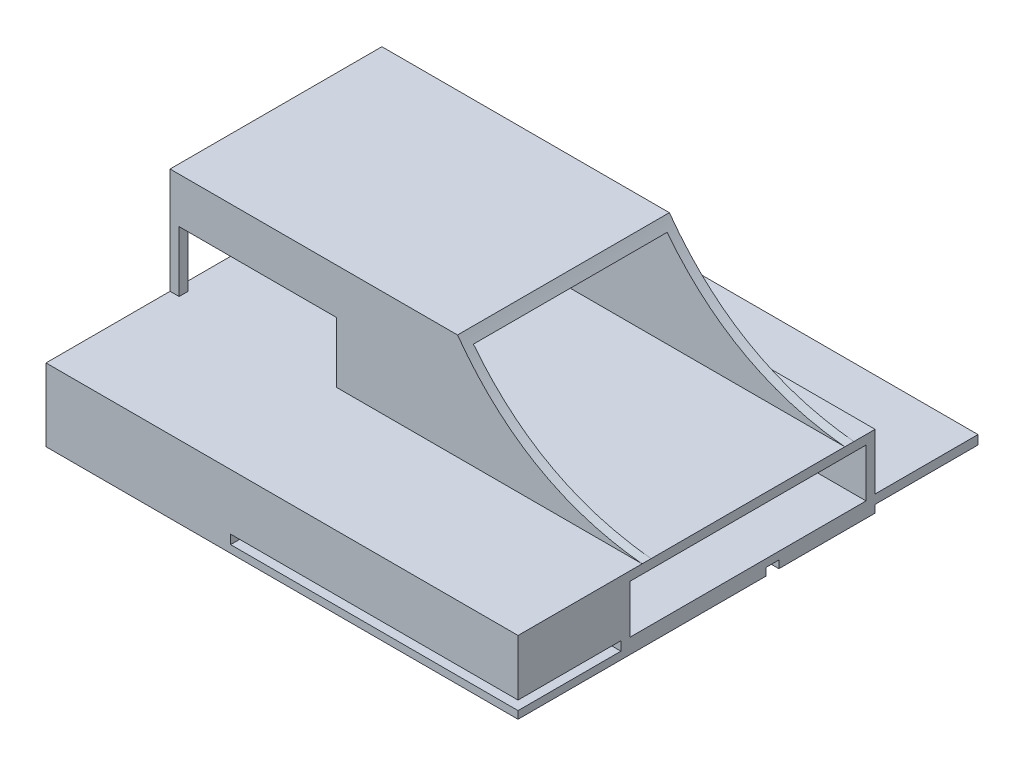
ISO-10303-21;
HEADER;
FILE_DESCRIPTION(('STEP AP214'),'2;1');
FILE_NAME('part.step','',(''),(''),'','','');
FILE_SCHEMA(('AUTOMOTIVE_DESIGN { 1 0 10303 214 1 1 1 1 }'));
ENDSEC;
DATA;
#1=APPLICATION_CONTEXT('core data for automotive mechanical design processes');
#2=APPLICATION_PROTOCOL_DEFINITION('international standard','automotive_design',2000,#1);
#3=PRODUCT_CONTEXT('',#1,'mechanical');
#4=PRODUCT('Part','Part','',(#3));
#5=PRODUCT_RELATED_PRODUCT_CATEGORY('part','',(#4));
#6=PRODUCT_DEFINITION_FORMATION('','',#4);
#7=PRODUCT_DEFINITION_CONTEXT('part definition',#1,'design');
#8=PRODUCT_DEFINITION('design','',#6,#7);
#9=PRODUCT_DEFINITION_SHAPE('','',#8);
#10=(LENGTH_UNIT() NAMED_UNIT(*) SI_UNIT(.MILLI.,.METRE.));
#11=(NAMED_UNIT(*) PLANE_ANGLE_UNIT() SI_UNIT($,.RADIAN.));
#12=(NAMED_UNIT(*) SI_UNIT($,.STERADIAN.) SOLID_ANGLE_UNIT());
#13=UNCERTAINTY_MEASURE_WITH_UNIT(LENGTH_MEASURE(1.E-05),#10,'distance_accuracy_value','');
#14=(GEOMETRIC_REPRESENTATION_CONTEXT(3) GLOBAL_UNCERTAINTY_ASSIGNED_CONTEXT((#13)) GLOBAL_UNIT_ASSIGNED_CONTEXT((#10,
#11,#12)) REPRESENTATION_CONTEXT('',''));
#15=CARTESIAN_POINT('',(0.,0.,0.));
#16=DIRECTION('',(0.,0.,1.));
#17=DIRECTION('',(1.,0.,0.));
#18=AXIS2_PLACEMENT_3D('',#15,#16,#17);
#19=CARTESIAN_POINT('',(-54.2981884270388,0.,19.0270270270271));
#20=DIRECTION('',(0.,0.,-1.));
#21=DIRECTION('',(0.,1.,0.));
#22=AXIS2_PLACEMENT_3D('',#19,#20,#21);
#23=PLANE('',#22);
#24=DIRECTION('',(0.,-1.,0.));
#25=VECTOR('',#24,1.);
#26=CARTESIAN_POINT('',(0.701811572961224,0.,19.0270270270271));
#27=LINE('',#26,#25);
#28=CARTESIAN_POINT('',(0.701811572961224,44.,19.0270270270271));
#29=VERTEX_POINT('',#28);
#30=CARTESIAN_POINT('',(0.701811572961224,24.,19.0270270270271));
#31=VERTEX_POINT('',#30);
#32=EDGE_CURVE('E330',#29,#31,#27,.T.);
#33=ORIENTED_EDGE('',*,*,#32,.T.);
#34=DIRECTION('',(1.,0.,0.));
#35=VECTOR('',#34,1.);
#36=CARTESIAN_POINT('',(-54.2981884270388,24.,19.0270270270271));
#37=LINE('',#36,#35);
#38=CARTESIAN_POINT('',(101.701811572961,24.,19.0270270270271));
#39=VERTEX_POINT('',#38);
#40=EDGE_CURVE('E464',#31,#39,#37,.T.);
#41=ORIENTED_EDGE('',*,*,#40,.T.);
#42=CARTESIAN_POINT('',(40.7018115729612,59.,19.0270270270271));
#43=CARTESIAN_POINT('',(63.2326989801919,27.7966980544731,19.0270270270271));
#44=CARTESIAN_POINT('',(101.701811572961,24.,19.0270270270271));
#45=B_SPLINE_CURVE_WITH_KNOTS('',2,(#42,#43,#44),.UNSPECIFIED.,.F.,.F.,(3,3),(0.,1.),.UNSPECIFIED.);
#46=CARTESIAN_POINT('',(40.7018115729612,59.,19.0270270270271));
#47=VERTEX_POINT('',#46);
#48=EDGE_CURVE('E342',#47,#39,#45,.T.);
#49=ORIENTED_EDGE('',*,*,#48,.F.);
#50=DIRECTION('',(1.,0.,0.));
#51=VECTOR('',#50,1.);
#52=CARTESIAN_POINT('',(-54.2981884270388,59.,19.0270270270271));
#53=LINE('',#52,#51);
#54=CARTESIAN_POINT('',(-54.2981884270388,59.,19.0270270270271));
#55=VERTEX_POINT('',#54);
#56=EDGE_CURVE('E472',#55,#47,#53,.T.);
#57=ORIENTED_EDGE('',*,*,#56,.F.);
#58=DIRECTION('',(0.,1.,0.));
#59=VECTOR('',#58,1.);
#60=CARTESIAN_POINT('',(-54.2981884270388,0.,19.0270270270271));
#61=LINE('',#60,#59);
#62=CARTESIAN_POINT('',(-54.2981884270388,24.,19.0270270270271));
#63=VERTEX_POINT('',#62);
#64=EDGE_CURVE('E462',#63,#55,#61,.T.);
#65=ORIENTED_EDGE('',*,*,#64,.F.);
#66=CARTESIAN_POINT('',(-51.2981884270388,24.,19.0270270270271));
#67=VERTEX_POINT('',#66);
#68=EDGE_CURVE('E459',#63,#67,#37,.T.);
#69=ORIENTED_EDGE('',*,*,#68,.T.);
#70=DIRECTION('',(0.,1.,0.));
#71=VECTOR('',#70,1.);
#72=CARTESIAN_POINT('',(-51.2981884270388,0.,19.0270270270271));
#73=LINE('',#72,#71);
#74=CARTESIAN_POINT('',(-51.2981884270388,44.,19.0270270270271));
#75=VERTEX_POINT('',#74);
#76=EDGE_CURVE('E336',#67,#75,#73,.T.);
#77=ORIENTED_EDGE('',*,*,#76,.T.);
#78=DIRECTION('',(1.,0.,0.));
#79=VECTOR('',#78,1.);
#80=CARTESIAN_POINT('',(0.,44.,19.0270270270271));
#81=LINE('',#80,#79);
#82=EDGE_CURVE('E333',#75,#29,#81,.T.);
#83=ORIENTED_EDGE('',*,*,#82,.T.);
#84=EDGE_LOOP('',(#33,#41,#49,#57,#65,#69,#77,#83));
#85=FACE_BOUND('',#84,.T.);
#86=ADVANCED_FACE('F35',(#85),#23,.F.);
#87=CARTESIAN_POINT('',(-54.2981884270388,0.,16.0270270270271));
#88=DIRECTION('',(0.,0.,1.));
#89=DIRECTION('',(1.,0.,0.));
#90=AXIS2_PLACEMENT_3D('',#87,#88,#89);
#91=PLANE('',#90);
#92=DIRECTION('',(0.,-1.,0.));
#93=VECTOR('',#92,1.);
#94=CARTESIAN_POINT('',(0.701811572961224,0.,16.0270270270271));
#95=LINE('',#94,#93);
#96=CARTESIAN_POINT('',(0.701811572961224,44.,16.0270270270271));
#97=VERTEX_POINT('',#96);
#98=CARTESIAN_POINT('',(0.701811572961224,24.,16.0270270270271));
#99=VERTEX_POINT('',#98);
#100=EDGE_CURVE('E11',#97,#99,#95,.T.);
#101=ORIENTED_EDGE('',*,*,#100,.F.);
#102=DIRECTION('',(1.,0.,0.));
#103=VECTOR('',#102,1.);
#104=CARTESIAN_POINT('',(-54.2981884270388,44.,16.0270270270271));
#105=LINE('',#104,#103);
#106=CARTESIAN_POINT('',(-51.2981884270388,44.,16.0270270270271));
#107=VERTEX_POINT('',#106);
#108=EDGE_CURVE('E531',#107,#97,#105,.T.);
#109=ORIENTED_EDGE('',*,*,#108,.F.);
#110=DIRECTION('',(0.,1.,0.));
#111=VECTOR('',#110,1.);
#112=CARTESIAN_POINT('',(-51.2981884270388,0.,16.0270270270271));
#113=LINE('',#112,#111);
#114=CARTESIAN_POINT('',(-51.2981884270388,24.,16.0270270270271));
#115=VERTEX_POINT('',#114);
#116=EDGE_CURVE('E43',#115,#107,#113,.T.);
#117=ORIENTED_EDGE('',*,*,#116,.F.);
#118=DIRECTION('',(1.,0.,0.));
#119=VECTOR('',#118,1.);
#120=CARTESIAN_POINT('',(-54.2981884270388,24.,16.0270270270271));
#121=LINE('',#120,#119);
#122=CARTESIAN_POINT('',(-54.2981884270388,24.,16.0270270270271));
#123=VERTEX_POINT('',#122);
#124=EDGE_CURVE('E501',#123,#115,#121,.T.);
#125=ORIENTED_EDGE('',*,*,#124,.F.);
#126=DIRECTION('',(0.,-1.,0.));
#127=VECTOR('',#126,1.);
#128=CARTESIAN_POINT('',(-54.2981884270388,0.,16.0270270270271));
#129=LINE('',#128,#127);
#130=CARTESIAN_POINT('',(-54.2981884270388,56.,16.0270270270271));
#131=VERTEX_POINT('',#130);
#132=EDGE_CURVE('E480',#131,#123,#129,.T.);
#133=ORIENTED_EDGE('',*,*,#132,.F.);
#134=DIRECTION('',(1.,0.,0.));
#135=VECTOR('',#134,1.);
#136=CARTESIAN_POINT('',(-54.2981884270388,56.,16.0270270270271));
#137=LINE('',#136,#135);
#138=CARTESIAN_POINT('',(42.954258478646,56.0000000095578,16.0270270270271));
#139=VERTEX_POINT('',#138);
#140=EDGE_CURVE('E490',#131,#139,#137,.T.);
#141=ORIENTED_EDGE('',*,*,#140,.T.);
#142=CARTESIAN_POINT('',(40.7018115729612,59.,16.0270270270271));
#143=CARTESIAN_POINT('',(63.2326989801919,27.7966980544731,16.0270270270271));
#144=CARTESIAN_POINT('',(101.701811572961,24.,16.0270270270271));
#145=B_SPLINE_CURVE_WITH_KNOTS('',2,(#142,#143,#144),.UNSPECIFIED.,.F.,.F.,(3,3),(0.,1.),.UNSPECIFIED.);
#146=CARTESIAN_POINT('',(101.701811572961,24.,16.0270270270271));
#147=VERTEX_POINT('',#146);
#148=EDGE_CURVE('E526',#139,#147,#145,.T.);
#149=ORIENTED_EDGE('',*,*,#148,.T.);
#150=EDGE_CURVE('E504',#99,#147,#121,.T.);
#151=ORIENTED_EDGE('',*,*,#150,.F.);
#152=EDGE_LOOP('',(#101,#109,#117,#125,#133,#141,#149,#151));
#153=FACE_BOUND('',#152,.T.);
#154=ADVANCED_FACE('F408',(#153),#91,.F.);
#155=CARTESIAN_POINT('',(-54.2981884270388,59.,-57.9729729729729));
#156=DIRECTION('',(1.,0.,0.));
#157=DIRECTION('',(0.,0.,-1.));
#158=AXIS2_PLACEMENT_3D('',#155,#156,#157);
#159=PLANE('',#158);
#160=DIRECTION('',(0.,0.,1.));
#161=VECTOR('',#160,1.);
#162=CARTESIAN_POINT('',(-54.2981884270388,24.,0.));
#163=LINE('',#162,#161);
#164=CARTESIAN_POINT('',(-54.2981884270388,24.,60.0270270270271));
#165=VERTEX_POINT('',#164);
#166=EDGE_CURVE('E457',#63,#165,#163,.T.);
#167=ORIENTED_EDGE('',*,*,#166,.F.);
#168=ORIENTED_EDGE('',*,*,#64,.T.);
#169=DIRECTION('',(0.,0.,1.));
#170=VECTOR('',#169,1.);
#171=CARTESIAN_POINT('',(-54.2981884270388,59.,-57.9729729729729));
#172=LINE('',#171,#170);
#173=CARTESIAN_POINT('',(-54.2981884270388,59.,-50.9729729729729));
#174=VERTEX_POINT('',#173);
#175=EDGE_CURVE('E507',#174,#55,#172,.T.);
#176=ORIENTED_EDGE('',*,*,#175,.F.);
#177=DIRECTION('',(0.,1.,0.));
#178=VECTOR('',#177,1.);
#179=CARTESIAN_POINT('',(-54.2981884270388,0.,-50.9729729729729));
#180=LINE('',#179,#178);
#181=CARTESIAN_POINT('',(-54.2981884270388,24.,-50.9729729729729));
#182=VERTEX_POINT('',#181);
#183=EDGE_CURVE('E545',#182,#174,#180,.T.);
#184=ORIENTED_EDGE('',*,*,#183,.F.);
#185=DIRECTION('',(0.,0.,1.));
#186=VECTOR('',#185,1.);
#187=CARTESIAN_POINT('',(-54.2981884270388,24.,0.));
#188=LINE('',#187,#186);
#189=CARTESIAN_POINT('',(-54.2981884270388,24.,-57.9729729729729));
#190=VERTEX_POINT('',#189);
#191=EDGE_CURVE('E539',#190,#182,#188,.T.);
#192=ORIENTED_EDGE('',*,*,#191,.F.);
#193=DIRECTION('',(0.,-1.,0.));
#194=VECTOR('',#193,1.);
#195=CARTESIAN_POINT('',(-54.2981884270388,59.,-57.9729729729729));
#196=LINE('',#195,#194);
#197=CARTESIAN_POINT('',(-54.2981884270388,0.,-57.9729729729729));
#198=VERTEX_POINT('',#197);
#199=EDGE_CURVE('E510',#190,#198,#196,.T.);
#200=ORIENTED_EDGE('',*,*,#199,.T.);
#201=DIRECTION('',(0.,0.,1.));
#202=VECTOR('',#201,1.);
#203=CARTESIAN_POINT('',(-54.2981884270388,0.,-57.9729729729729));
#204=LINE('',#203,#202);
#205=CARTESIAN_POINT('',(-54.2981884270388,0.,-26.1729729729729));
#206=VERTEX_POINT('',#205);
#207=EDGE_CURVE('E512',#198,#206,#204,.T.);
#208=ORIENTED_EDGE('',*,*,#207,.T.);
#209=DIRECTION('',(0.,-1.,0.));
#210=VECTOR('',#209,1.);
#211=CARTESIAN_POINT('',(-54.2981884270388,0.,-26.1729729729729));
#212=LINE('',#211,#210);
#213=CARTESIAN_POINT('',(-54.2981884270388,2.5,-26.1729729729729));
#214=VERTEX_POINT('',#213);
#215=EDGE_CURVE('E593',#214,#206,#212,.T.);
#216=ORIENTED_EDGE('',*,*,#215,.F.);
#217=DIRECTION('',(0.,0.,-1.));
#218=VECTOR('',#217,1.);
#219=CARTESIAN_POINT('',(-54.2981884270388,2.5,0.));
#220=LINE('',#219,#218);
#221=CARTESIAN_POINT('',(-54.2981884270388,2.5,-21.9729729729729));
#222=VERTEX_POINT('',#221);
#223=EDGE_CURVE('E595',#222,#214,#220,.T.);
#224=ORIENTED_EDGE('',*,*,#223,.F.);
#225=DIRECTION('',(0.,1.,0.));
#226=VECTOR('',#225,1.);
#227=CARTESIAN_POINT('',(-54.2981884270388,0.,-21.9729729729729));
#228=LINE('',#227,#226);
#229=CARTESIAN_POINT('',(-54.2981884270388,0.,-21.9729729729729));
#230=VERTEX_POINT('',#229);
#231=EDGE_CURVE('E598',#230,#222,#228,.T.);
#232=ORIENTED_EDGE('',*,*,#231,.F.);
#233=CARTESIAN_POINT('',(-54.2981884270388,0.,60.0270270270271));
#234=VERTEX_POINT('',#233);
#235=EDGE_CURVE('E497',#230,#234,#204,.T.);
#236=ORIENTED_EDGE('',*,*,#235,.T.);
#237=DIRECTION('',(0.,-1.,0.));
#238=VECTOR('',#237,1.);
#239=CARTESIAN_POINT('',(-54.2981884270388,0.,60.0270270270271));
#240=LINE('',#239,#238);
#241=EDGE_CURVE('E280',#165,#234,#240,.T.);
#242=ORIENTED_EDGE('',*,*,#241,.F.);
#243=EDGE_LOOP('',(#167,#168,#176,#184,#192,#200,#208,#216,#224,#232,#236,#242));
#244=FACE_BOUND('',#243,.T.);
#245=DIRECTION('',(0.,1.,0.));
#246=VECTOR('',#245,1.);
#247=CARTESIAN_POINT('',(-54.2981884270388,0.,-47.9729729729729));
#248=LINE('',#247,#246);
#249=CARTESIAN_POINT('',(-54.2981884270388,24.,-47.9729729729729));
#250=VERTEX_POINT('',#249);
#251=CARTESIAN_POINT('',(-54.2981884270388,56.,-47.9729729729729));
#252=VERTEX_POINT('',#251);
#253=EDGE_CURVE('E487',#250,#252,#248,.T.);
#254=ORIENTED_EDGE('',*,*,#253,.T.);
#255=DIRECTION('',(0.,0.,1.));
#256=VECTOR('',#255,1.);
#257=CARTESIAN_POINT('',(-54.2981884270388,56.,0.));
#258=LINE('',#257,#256);
#259=EDGE_CURVE('E477',#252,#131,#258,.T.);
#260=ORIENTED_EDGE('',*,*,#259,.T.);
#261=ORIENTED_EDGE('',*,*,#132,.T.);
#262=DIRECTION('',(0.,0.,1.));
#263=VECTOR('',#262,1.);
#264=CARTESIAN_POINT('',(-54.2981884270388,24.,0.));
#265=LINE('',#264,#263);
#266=EDGE_CURVE('E484',#250,#123,#265,.T.);
#267=ORIENTED_EDGE('',*,*,#266,.F.);
#268=EDGE_LOOP('',(#254,#260,#261,#267));
#269=FACE_BOUND('',#268,.T.);
#270=DIRECTION('',(0.,-1.,0.));
#271=VECTOR('',#270,1.);
#272=CARTESIAN_POINT('',(-54.2981884270388,0.,-54.9729729729729));
#273=LINE('',#272,#271);
#274=CARTESIAN_POINT('',(-54.2981884270388,21.,-54.9729729729729));
#275=VERTEX_POINT('',#274);
#276=CARTESIAN_POINT('',(-54.2981884270388,5.,-54.9729729729729));
#277=VERTEX_POINT('',#276);
#278=EDGE_CURVE('E617',#275,#277,#273,.T.);
#279=ORIENTED_EDGE('',*,*,#278,.F.);
#280=DIRECTION('',(0.,0.,-1.));
#281=VECTOR('',#280,1.);
#282=CARTESIAN_POINT('',(-54.2981884270388,21.,0.));
#283=LINE('',#282,#281);
#284=CARTESIAN_POINT('',(-54.2981884270388,21.,23.0270270270271));
#285=VERTEX_POINT('',#284);
#286=EDGE_CURVE('E619',#285,#275,#283,.T.);
#287=ORIENTED_EDGE('',*,*,#286,.F.);
#288=DIRECTION('',(0.,1.,0.));
#289=VECTOR('',#288,1.);
#290=CARTESIAN_POINT('',(-54.2981884270388,0.,23.0270270270271));
#291=LINE('',#290,#289);
#292=CARTESIAN_POINT('',(-54.2981884270388,5.,23.0270270270271));
#293=VERTEX_POINT('',#292);
#294=EDGE_CURVE('E622',#293,#285,#291,.T.);
#295=ORIENTED_EDGE('',*,*,#294,.F.);
#296=DIRECTION('',(0.,0.,1.));
#297=VECTOR('',#296,1.);
#298=CARTESIAN_POINT('',(-54.2981884270388,5.,0.));
#299=LINE('',#298,#297);
#300=EDGE_CURVE('E625',#277,#293,#299,.T.);
#301=ORIENTED_EDGE('',*,*,#300,.F.);
#302=EDGE_LOOP('',(#279,#287,#295,#301));
#303=FACE_BOUND('',#302,.T.);
#304=ADVANCED_FACE('F37',(#244,#269,#303),#159,.F.);
#305=CARTESIAN_POINT('',(-54.2981884270388,59.,26.0270270270271));
#306=DIRECTION('',(0.,0.,-1.));
#307=DIRECTION('',(-1.,0.,0.));
#308=AXIS2_PLACEMENT_3D('',#305,#306,#307);
#309=PLANE('',#308);
#310=DIRECTION('',(0.,-1.,0.));
#311=VECTOR('',#310,1.);
#312=CARTESIAN_POINT('',(6.70181157296122,0.,26.0270270270271));
#313=LINE('',#312,#311);
#314=CARTESIAN_POINT('',(6.70181157296122,5.49999999999999,26.0270270270271));
#315=VERTEX_POINT('',#314);
#316=CARTESIAN_POINT('',(6.70181157296122,2.5,26.0270270270271));
#317=VERTEX_POINT('',#316);
#318=EDGE_CURVE('E286',#315,#317,#313,.T.);
#319=ORIENTED_EDGE('',*,*,#318,.T.);
#320=DIRECTION('',(1.,0.,0.));
#321=VECTOR('',#320,1.);
#322=CARTESIAN_POINT('',(0.,2.5,26.0270270270271));
#323=LINE('',#322,#321);
#324=CARTESIAN_POINT('',(101.701811572961,2.5,26.0270270270271));
#325=VERTEX_POINT('',#324);
#326=EDGE_CURVE('E50',#317,#325,#323,.T.);
#327=ORIENTED_EDGE('',*,*,#326,.T.);
#328=DIRECTION('',(0.,-1.,0.));
#329=VECTOR('',#328,1.);
#330=CARTESIAN_POINT('',(101.701811572961,59.,26.0270270270271));
#331=LINE('',#330,#329);
#332=CARTESIAN_POINT('',(101.701811572961,5.5,26.0270270270271));
#333=VERTEX_POINT('',#332);
#334=EDGE_CURVE('E447',#333,#325,#331,.T.);
#335=ORIENTED_EDGE('',*,*,#334,.F.);
#336=DIRECTION('',(-1.,0.,0.));
#337=VECTOR('',#336,1.);
#338=CARTESIAN_POINT('',(0.,5.49999999999999,26.0270270270271));
#339=LINE('',#338,#337);
#340=EDGE_CURVE('E267',#333,#315,#339,.T.);
#341=ORIENTED_EDGE('',*,*,#340,.T.);
#342=EDGE_LOOP('',(#319,#327,#335,#341));
#343=FACE_BOUND('',#342,.T.);
#344=ADVANCED_FACE('F436',(#343),#309,.F.);
#345=CARTESIAN_POINT('',(101.701811572961,59.,-57.9729729729729));
#346=DIRECTION('',(-1.,0.,0.));
#347=DIRECTION('',(0.,0.,1.));
#348=AXIS2_PLACEMENT_3D('',#345,#346,#347);
#349=PLANE('',#348);
#350=DIRECTION('',(0.,0.,1.));
#351=VECTOR('',#350,1.);
#352=CARTESIAN_POINT('',(101.701811572961,24.,0.));
#353=LINE('',#352,#351);
#354=CARTESIAN_POINT('',(101.701811572961,24.,-57.9729729729729));
#355=VERTEX_POINT('',#354);
#356=CARTESIAN_POINT('',(101.701811572961,24.,-50.9729729729729));
#357=VERTEX_POINT('',#356);
#358=EDGE_CURVE('E542',#355,#357,#353,.T.);
#359=ORIENTED_EDGE('',*,*,#358,.T.);
#360=DIRECTION('',(0.,0.,1.));
#361=VECTOR('',#360,1.);
#362=CARTESIAN_POINT('',(101.701811572961,24.,-57.9729729729729));
#363=LINE('',#362,#361);
#364=CARTESIAN_POINT('',(101.701811572961,24.,-47.9729729729729));
#365=VERTEX_POINT('',#364);
#366=EDGE_CURVE('E573',#357,#365,#363,.T.);
#367=ORIENTED_EDGE('',*,*,#366,.T.);
#368=DIRECTION('',(0.,0.,1.));
#369=VECTOR('',#368,1.);
#370=CARTESIAN_POINT('',(101.701811572961,24.,0.));
#371=LINE('',#370,#369);
#372=EDGE_CURVE('E481',#365,#147,#371,.T.);
#373=ORIENTED_EDGE('',*,*,#372,.T.);
#374=EDGE_CURVE('E572',#147,#39,#363,.T.);
#375=ORIENTED_EDGE('',*,*,#374,.T.);
#376=DIRECTION('',(0.,0.,1.));
#377=VECTOR('',#376,1.);
#378=CARTESIAN_POINT('',(101.701811572961,24.,0.));
#379=LINE('',#378,#377);
#380=CARTESIAN_POINT('',(101.701811572961,24.,60.0270270270271));
#381=VERTEX_POINT('',#380);
#382=EDGE_CURVE('E455',#39,#381,#379,.T.);
#383=ORIENTED_EDGE('',*,*,#382,.T.);
#384=DIRECTION('',(0.,1.,0.));
#385=VECTOR('',#384,1.);
#386=CARTESIAN_POINT('',(101.701811572961,0.,60.0270270270271));
#387=LINE('',#386,#385);
#388=CARTESIAN_POINT('',(101.701811572961,5.5,60.0270270270271));
#389=VERTEX_POINT('',#388);
#390=EDGE_CURVE('E272',#389,#381,#387,.T.);
#391=ORIENTED_EDGE('',*,*,#390,.F.);
#392=DIRECTION('',(0.,0.,-1.));
#393=VECTOR('',#392,1.);
#394=CARTESIAN_POINT('',(101.701811572961,5.5,60.0270270270271));
#395=LINE('',#394,#393);
#396=EDGE_CURVE('E292',#389,#333,#395,.T.);
#397=ORIENTED_EDGE('',*,*,#396,.T.);
#398=ORIENTED_EDGE('',*,*,#334,.T.);
#399=DIRECTION('',(0.,0.,-1.));
#400=VECTOR('',#399,1.);
#401=CARTESIAN_POINT('',(101.701811572961,2.5,60.0270270270271));
#402=LINE('',#401,#400);
#403=CARTESIAN_POINT('',(101.701811572961,2.5,60.0270270270271));
#404=VERTEX_POINT('',#403);
#405=EDGE_CURVE('E290',#404,#325,#402,.T.);
#406=ORIENTED_EDGE('',*,*,#405,.F.);
#407=CARTESIAN_POINT('',(101.701811572961,0.,60.0270270270271));
#408=VERTEX_POINT('',#407);
#409=EDGE_CURVE('E265',#408,#404,#387,.T.);
#410=ORIENTED_EDGE('',*,*,#409,.F.);
#411=DIRECTION('',(0.,0.,-1.));
#412=VECTOR('',#411,1.);
#413=CARTESIAN_POINT('',(101.701811572961,0.,-57.9729729729729));
#414=LINE('',#413,#412);
#415=CARTESIAN_POINT('',(101.701811572961,0.,-21.9729729729729));
#416=VERTEX_POINT('',#415);
#417=EDGE_CURVE('E516',#408,#416,#414,.T.);
#418=ORIENTED_EDGE('',*,*,#417,.T.);
#419=DIRECTION('',(0.,1.,0.));
#420=VECTOR('',#419,1.);
#421=CARTESIAN_POINT('',(101.701811572961,0.,-21.9729729729729));
#422=LINE('',#421,#420);
#423=CARTESIAN_POINT('',(101.701811572961,2.5,-21.9729729729729));
#424=VERTEX_POINT('',#423);
#425=EDGE_CURVE('E596',#416,#424,#422,.T.);
#426=ORIENTED_EDGE('',*,*,#425,.T.);
#427=DIRECTION('',(0.,0.,-1.));
#428=VECTOR('',#427,1.);
#429=CARTESIAN_POINT('',(101.701811572961,2.5,0.));
#430=LINE('',#429,#428);
#431=CARTESIAN_POINT('',(101.701811572961,2.5,-26.1729729729729));
#432=VERTEX_POINT('',#431);
#433=EDGE_CURVE('E604',#424,#432,#430,.T.);
#434=ORIENTED_EDGE('',*,*,#433,.T.);
#435=DIRECTION('',(0.,-1.,0.));
#436=VECTOR('',#435,1.);
#437=CARTESIAN_POINT('',(101.701811572961,0.,-26.1729729729729));
#438=LINE('',#437,#436);
#439=CARTESIAN_POINT('',(101.701811572961,0.,-26.1729729729729));
#440=VERTEX_POINT('',#439);
#441=EDGE_CURVE('E601',#432,#440,#438,.T.);
#442=ORIENTED_EDGE('',*,*,#441,.T.);
#443=CARTESIAN_POINT('',(101.701811572961,0.,-57.9729729729729));
#444=VERTEX_POINT('',#443);
#445=EDGE_CURVE('E515',#440,#444,#414,.T.);
#446=ORIENTED_EDGE('',*,*,#445,.T.);
#447=DIRECTION('',(0.,-1.,0.));
#448=VECTOR('',#447,1.);
#449=CARTESIAN_POINT('',(101.701811572961,59.,-57.9729729729729));
#450=LINE('',#449,#448);
#451=CARTESIAN_POINT('',(101.701811572961,2.50000000000001,-57.9729729729729));
#452=VERTEX_POINT('',#451);
#453=EDGE_CURVE('E522',#452,#444,#450,.T.);
#454=ORIENTED_EDGE('',*,*,#453,.F.);
#455=DIRECTION('',(0.,0.,1.));
#456=VECTOR('',#455,1.);
#457=CARTESIAN_POINT('',(101.701811572961,2.5,-91.9729729729729));
#458=LINE('',#457,#456);
#459=CARTESIAN_POINT('',(101.701811572961,2.5,-91.9729729729729));
#460=VERTEX_POINT('',#459);
#461=EDGE_CURVE('E324',#460,#452,#458,.T.);
#462=ORIENTED_EDGE('',*,*,#461,.F.);
#463=DIRECTION('',(0.,-1.,0.));
#464=VECTOR('',#463,1.);
#465=CARTESIAN_POINT('',(101.701811572961,0.,-91.9729729729729));
#466=LINE('',#465,#464);
#467=CARTESIAN_POINT('',(101.701811572961,5.5,-91.9729729729729));
#468=VERTEX_POINT('',#467);
#469=EDGE_CURVE('E298',#468,#460,#466,.T.);
#470=ORIENTED_EDGE('',*,*,#469,.F.);
#471=DIRECTION('',(0.,0.,1.));
#472=VECTOR('',#471,1.);
#473=CARTESIAN_POINT('',(101.701811572961,5.5,-91.9729729729729));
#474=LINE('',#473,#472);
#475=CARTESIAN_POINT('',(101.701811572961,5.5,-57.9729729729729));
#476=VERTEX_POINT('',#475);
#477=EDGE_CURVE('E327',#468,#476,#474,.T.);
#478=ORIENTED_EDGE('',*,*,#477,.T.);
#479=EDGE_CURVE('E523',#355,#476,#450,.T.);
#480=ORIENTED_EDGE('',*,*,#479,.F.);
#481=EDGE_LOOP('',(#359,#367,#373,#375,#383,#391,#397,#398,#406,#410,#418,#426,#434,#442,#446,
#454,#462,#470,#478,#480));
#482=FACE_BOUND('',#481,.T.);
#483=DIRECTION('',(0.,-1.,0.));
#484=VECTOR('',#483,1.);
#485=CARTESIAN_POINT('',(101.701811572961,0.,-54.9729729729729));
#486=LINE('',#485,#484);
#487=CARTESIAN_POINT('',(101.701811572961,21.,-54.9729729729729));
#488=VERTEX_POINT('',#487);
#489=CARTESIAN_POINT('',(101.701811572961,5.,-54.9729729729729));
#490=VERTEX_POINT('',#489);
#491=EDGE_CURVE('E475',#488,#490,#486,.T.);
#492=ORIENTED_EDGE('',*,*,#491,.T.);
#493=DIRECTION('',(0.,0.,1.));
#494=VECTOR('',#493,1.);
#495=CARTESIAN_POINT('',(101.701811572961,5.,0.));
#496=LINE('',#495,#494);
#497=CARTESIAN_POINT('',(101.701811572961,5.,23.0270270270271));
#498=VERTEX_POINT('',#497);
#499=EDGE_CURVE('E620',#490,#498,#496,.T.);
#500=ORIENTED_EDGE('',*,*,#499,.T.);
#501=DIRECTION('',(0.,1.,0.));
#502=VECTOR('',#501,1.);
#503=CARTESIAN_POINT('',(101.701811572961,0.,23.0270270270271));
#504=LINE('',#503,#502);
#505=CARTESIAN_POINT('',(101.701811572961,21.,23.0270270270271));
#506=VERTEX_POINT('',#505);
#507=EDGE_CURVE('E632',#498,#506,#504,.T.);
#508=ORIENTED_EDGE('',*,*,#507,.T.);
#509=DIRECTION('',(0.,0.,-1.));
#510=VECTOR('',#509,1.);
#511=CARTESIAN_POINT('',(101.701811572961,21.,0.));
#512=LINE('',#511,#510);
#513=EDGE_CURVE('E629',#506,#488,#512,.T.);
#514=ORIENTED_EDGE('',*,*,#513,.T.);
#515=EDGE_LOOP('',(#492,#500,#508,#514));
#516=FACE_BOUND('',#515,.T.);
#517=ADVANCED_FACE('F434',(#482,#516),#349,.F.);
#518=CARTESIAN_POINT('',(-54.2981884270388,59.,-57.9729729729729));
#519=DIRECTION('',(0.,0.,1.));
#520=DIRECTION('',(1.,0.,0.));
#521=AXIS2_PLACEMENT_3D('',#518,#519,#520);
#522=PLANE('',#521);
#523=ORIENTED_EDGE('',*,*,#479,.T.);
#524=DIRECTION('',(-1.,0.,0.));
#525=VECTOR('',#524,1.);
#526=CARTESIAN_POINT('',(0.,5.5,-57.9729729729729));
#527=LINE('',#526,#525);
#528=CARTESIAN_POINT('',(6.70181157296122,5.5,-57.9729729729729));
#529=VERTEX_POINT('',#528);
#530=EDGE_CURVE('E58',#476,#529,#527,.T.);
#531=ORIENTED_EDGE('',*,*,#530,.T.);
#532=DIRECTION('',(0.,-1.,0.));
#533=VECTOR('',#532,1.);
#534=CARTESIAN_POINT('',(6.70181157296122,0.,-57.9729729729729));
#535=LINE('',#534,#533);
#536=CARTESIAN_POINT('',(6.70181157296122,2.66052631578947,-57.9729729729729));
#537=VERTEX_POINT('',#536);
#538=EDGE_CURVE('E299',#529,#537,#535,.T.);
#539=ORIENTED_EDGE('',*,*,#538,.T.);
#540=DIRECTION('',(0.999996537414106,0.0026315698353002,0.));
#541=VECTOR('',#540,1.);
#542=CARTESIAN_POINT('',(-0.00695492543976156,2.64287166710947,-57.9729729729729));
#543=LINE('',#542,#541);
#544=CARTESIAN_POINT('',(40.7018115729612,2.74999999999999,-57.9729729729729));
#545=VERTEX_POINT('',#544);
#546=EDGE_CURVE('E314',#537,#545,#543,.T.);
#547=ORIENTED_EDGE('',*,*,#546,.T.);
#548=DIRECTION('',(-0.999991601825763,0.00409832623699072,0.));
#549=VECTOR('',#548,1.);
#550=CARTESIAN_POINT('',(0.0119539414410021,2.91676171160458,-57.9729729729729));
#551=LINE('',#550,#549);
#552=EDGE_CURVE('E311',#452,#545,#551,.T.);
#553=ORIENTED_EDGE('',*,*,#552,.F.);
#554=ORIENTED_EDGE('',*,*,#453,.T.);
#555=DIRECTION('',(-1.,0.,0.));
#556=VECTOR('',#555,1.);
#557=CARTESIAN_POINT('',(-54.2981884270388,0.,-57.9729729729729));
#558=LINE('',#557,#556);
#559=EDGE_CURVE('E511',#444,#198,#558,.T.);
#560=ORIENTED_EDGE('',*,*,#559,.T.);
#561=ORIENTED_EDGE('',*,*,#199,.F.);
#562=DIRECTION('',(1.,0.,0.));
#563=VECTOR('',#562,1.);
#564=CARTESIAN_POINT('',(-54.2981884270388,24.,-57.9729729729729));
#565=LINE('',#564,#563);
#566=EDGE_CURVE('E538',#190,#355,#565,.T.);
#567=ORIENTED_EDGE('',*,*,#566,.T.);
#568=EDGE_LOOP('',(#523,#531,#539,#547,#553,#554,#560,#561,#567));
#569=FACE_BOUND('',#568,.T.);
#570=ADVANCED_FACE('F427',(#569),#522,.F.);
#571=CARTESIAN_POINT('',(0.,59.,0.));
#572=DIRECTION('',(0.,1.,0.));
#573=DIRECTION('',(0.,0.,1.));
#574=AXIS2_PLACEMENT_3D('',#571,#572,#573);
#575=PLANE('',#574);
#576=DIRECTION('',(0.,0.,1.));
#577=VECTOR('',#576,1.);
#578=CARTESIAN_POINT('',(40.7018115729612,59.,-57.9729729729729));
#579=LINE('',#578,#577);
#580=CARTESIAN_POINT('',(40.7018115729612,59.,-50.9729729729729));
#581=VERTEX_POINT('',#580);
#582=EDGE_CURVE('E585',#581,#47,#579,.T.);
#583=ORIENTED_EDGE('',*,*,#582,.F.);
#584=DIRECTION('',(1.,0.,0.));
#585=VECTOR('',#584,1.);
#586=CARTESIAN_POINT('',(-54.2981884270388,59.,-50.9729729729729));
#587=LINE('',#586,#585);
#588=EDGE_CURVE('E466',#174,#581,#587,.T.);
#589=ORIENTED_EDGE('',*,*,#588,.F.);
#590=ORIENTED_EDGE('',*,*,#175,.T.);
#591=ORIENTED_EDGE('',*,*,#56,.T.);
#592=EDGE_LOOP('',(#583,#589,#590,#591));
#593=FACE_BOUND('',#592,.T.);
#594=ADVANCED_FACE('F423',(#593),#575,.T.);
#595=CARTESIAN_POINT('',(0.,0.,0.));
#596=DIRECTION('',(0.,1.,0.));
#597=DIRECTION('',(0.,0.,1.));
#598=AXIS2_PLACEMENT_3D('',#595,#596,#597);
#599=PLANE('',#598);
#600=DIRECTION('',(1.,0.,0.));
#601=VECTOR('',#600,1.);
#602=CARTESIAN_POINT('',(-54.2981884270388,0.,-26.1729729729729));
#603=LINE('',#602,#601);
#604=EDGE_CURVE('E546',#206,#440,#603,.T.);
#605=ORIENTED_EDGE('',*,*,#604,.F.);
#606=ORIENTED_EDGE('',*,*,#207,.F.);
#607=ORIENTED_EDGE('',*,*,#559,.F.);
#608=ORIENTED_EDGE('',*,*,#445,.F.);
#609=EDGE_LOOP('',(#605,#606,#607,#608));
#610=FACE_BOUND('',#609,.T.);
#611=ADVANCED_FACE('F426',(#610),#599,.F.);
#612=DIRECTION('',(1.,0.,0.));
#613=VECTOR('',#612,1.);
#614=CARTESIAN_POINT('',(-54.2981884270388,0.,-21.9729729729729));
#615=LINE('',#614,#613);
#616=EDGE_CURVE('E611',#230,#416,#615,.T.);
#617=ORIENTED_EDGE('',*,*,#616,.T.);
#618=ORIENTED_EDGE('',*,*,#417,.F.);
#619=DIRECTION('',(1.,0.,0.));
#620=VECTOR('',#619,1.);
#621=CARTESIAN_POINT('',(0.,0.,60.0270270270271));
#622=LINE('',#621,#620);
#623=EDGE_CURVE('E283',#234,#408,#622,.T.);
#624=ORIENTED_EDGE('',*,*,#623,.F.);
#625=ORIENTED_EDGE('',*,*,#235,.F.);
#626=EDGE_LOOP('',(#617,#618,#624,#625));
#627=FACE_BOUND('',#626,.T.);
#628=ADVANCED_FACE('F388',(#627),#599,.F.);
#629=CARTESIAN_POINT('',(-54.2981884270388,0.,-26.1729729729729));
#630=DIRECTION('',(0.,0.,1.));
#631=DIRECTION('',(0.,-1.,0.));
#632=AXIS2_PLACEMENT_3D('',#629,#630,#631);
#633=PLANE('',#632);
#634=ORIENTED_EDGE('',*,*,#441,.F.);
#635=DIRECTION('',(1.,0.,0.));
#636=VECTOR('',#635,1.);
#637=CARTESIAN_POINT('',(-54.2981884270388,2.5,-26.1729729729729));
#638=LINE('',#637,#636);
#639=EDGE_CURVE('E600',#214,#432,#638,.T.);
#640=ORIENTED_EDGE('',*,*,#639,.F.);
#641=ORIENTED_EDGE('',*,*,#215,.T.);
#642=ORIENTED_EDGE('',*,*,#604,.T.);
#643=EDGE_LOOP('',(#634,#640,#641,#642));
#644=FACE_BOUND('',#643,.T.);
#645=ADVANCED_FACE('F381',(#644),#633,.T.);
#646=CARTESIAN_POINT('',(-54.2981884270388,0.,-21.9729729729729));
#647=DIRECTION('',(0.,0.,-1.));
#648=DIRECTION('',(-1.,0.,0.));
#649=AXIS2_PLACEMENT_3D('',#646,#647,#648);
#650=PLANE('',#649);
#651=ORIENTED_EDGE('',*,*,#425,.F.);
#652=ORIENTED_EDGE('',*,*,#616,.F.);
#653=ORIENTED_EDGE('',*,*,#231,.T.);
#654=DIRECTION('',(1.,0.,0.));
#655=VECTOR('',#654,1.);
#656=CARTESIAN_POINT('',(-54.2981884270388,2.5,-21.9729729729729));
#657=LINE('',#656,#655);
#658=EDGE_CURVE('E614',#222,#424,#657,.T.);
#659=ORIENTED_EDGE('',*,*,#658,.T.);
#660=EDGE_LOOP('',(#651,#652,#653,#659));
#661=FACE_BOUND('',#660,.T.);
#662=ADVANCED_FACE('F378',(#661),#650,.T.);
#663=CARTESIAN_POINT('',(-54.2981884270388,2.5,0.));
#664=DIRECTION('',(0.,-1.,0.));
#665=DIRECTION('',(0.,0.,-1.));
#666=AXIS2_PLACEMENT_3D('',#663,#664,#665);
#667=PLANE('',#666);
#668=ORIENTED_EDGE('',*,*,#433,.F.);
#669=ORIENTED_EDGE('',*,*,#658,.F.);
#670=ORIENTED_EDGE('',*,*,#223,.T.);
#671=ORIENTED_EDGE('',*,*,#639,.T.);
#672=EDGE_LOOP('',(#668,#669,#670,#671));
#673=FACE_BOUND('',#672,.T.);
#674=ADVANCED_FACE('F376',(#673),#667,.T.);
#675=CARTESIAN_POINT('',(-54.2981884270388,0.,-50.9729729729729));
#676=DIRECTION('',(0.,0.,-1.));
#677=DIRECTION('',(0.,1.,0.));
#678=AXIS2_PLACEMENT_3D('',#675,#676,#677);
#679=PLANE('',#678);
#680=CARTESIAN_POINT('',(40.7018115729612,59.,-50.9729729729729));
#681=CARTESIAN_POINT('',(63.2326989801919,27.7966980544731,-50.9729729729729));
#682=CARTESIAN_POINT('',(101.701811572961,24.,-50.9729729729729));
#683=B_SPLINE_CURVE_WITH_KNOTS('',2,(#680,#681,#682),.UNSPECIFIED.,.F.,.F.,(3,3),(0.,1.),.UNSPECIFIED.);
#684=EDGE_CURVE('E605',#357,#581,#683,.F.);
#685=ORIENTED_EDGE('',*,*,#684,.F.);
#686=DIRECTION('',(1.,0.,0.));
#687=VECTOR('',#686,1.);
#688=CARTESIAN_POINT('',(-54.2981884270388,24.,-50.9729729729729));
#689=LINE('',#688,#687);
#690=EDGE_CURVE('E532',#182,#357,#689,.T.);
#691=ORIENTED_EDGE('',*,*,#690,.F.);
#692=ORIENTED_EDGE('',*,*,#183,.T.);
#693=ORIENTED_EDGE('',*,*,#588,.T.);
#694=EDGE_LOOP('',(#685,#691,#692,#693));
#695=FACE_BOUND('',#694,.T.);
#696=ADVANCED_FACE('F372',(#695),#679,.T.);
#697=CARTESIAN_POINT('',(-54.2981884270388,24.,0.));
#698=DIRECTION('',(0.,1.,0.));
#699=DIRECTION('',(0.,0.,1.));
#700=AXIS2_PLACEMENT_3D('',#697,#698,#699);
#701=PLANE('',#700);
#702=ORIENTED_EDGE('',*,*,#358,.F.);
#703=ORIENTED_EDGE('',*,*,#566,.F.);
#704=ORIENTED_EDGE('',*,*,#191,.T.);
#705=ORIENTED_EDGE('',*,*,#690,.T.);
#706=EDGE_LOOP('',(#702,#703,#704,#705));
#707=FACE_BOUND('',#706,.T.);
#708=ADVANCED_FACE('F368',(#707),#701,.T.);
#709=CARTESIAN_POINT('',(-54.2981884270388,24.,0.));
#710=DIRECTION('',(0.,1.,0.));
#711=DIRECTION('',(0.,0.,1.));
#712=AXIS2_PLACEMENT_3D('',#709,#710,#711);
#713=PLANE('',#712);
#714=ORIENTED_EDGE('',*,*,#382,.F.);
#715=ORIENTED_EDGE('',*,*,#40,.F.);
#716=DIRECTION('',(0.,0.,1.));
#717=VECTOR('',#716,1.);
#718=CARTESIAN_POINT('',(0.701811572961224,24.,-39.9729729729729));
#719=LINE('',#718,#717);
#720=EDGE_CURVE('E340',#99,#31,#719,.T.);
#721=ORIENTED_EDGE('',*,*,#720,.F.);
#722=ORIENTED_EDGE('',*,*,#150,.T.);
#723=ORIENTED_EDGE('',*,*,#372,.F.);
#724=DIRECTION('',(1.,0.,0.));
#725=VECTOR('',#724,1.);
#726=CARTESIAN_POINT('',(-54.2981884270388,24.,-47.9729729729729));
#727=LINE('',#726,#725);
#728=EDGE_CURVE('E498',#250,#365,#727,.T.);
#729=ORIENTED_EDGE('',*,*,#728,.F.);
#730=ORIENTED_EDGE('',*,*,#266,.T.);
#731=ORIENTED_EDGE('',*,*,#124,.T.);
#732=DIRECTION('',(0.,0.,1.));
#733=VECTOR('',#732,1.);
#734=CARTESIAN_POINT('',(-51.2981884270388,24.,-39.9729729729729));
#735=LINE('',#734,#733);
#736=EDGE_CURVE('E343',#115,#67,#735,.T.);
#737=ORIENTED_EDGE('',*,*,#736,.T.);
#738=ORIENTED_EDGE('',*,*,#68,.F.);
#739=ORIENTED_EDGE('',*,*,#166,.T.);
#740=DIRECTION('',(-1.,0.,0.));
#741=VECTOR('',#740,1.);
#742=CARTESIAN_POINT('',(0.,24.,60.0270270270271));
#743=LINE('',#742,#741);
#744=EDGE_CURVE('E277',#381,#165,#743,.T.);
#745=ORIENTED_EDGE('',*,*,#744,.F.);
#746=EDGE_LOOP('',(#714,#715,#721,#722,#723,#729,#730,#731,#737,#738,#739,#745));
#747=FACE_BOUND('',#746,.T.);
#748=ADVANCED_FACE('F371',(#747),#713,.T.);
#749=CARTESIAN_POINT('',(-54.2981884270388,56.,0.));
#750=DIRECTION('',(0.,1.,0.));
#751=DIRECTION('',(0.,0.,1.));
#752=AXIS2_PLACEMENT_3D('',#749,#750,#751);
#753=PLANE('',#752);
#754=DIRECTION('',(1.,0.,0.));
#755=VECTOR('',#754,1.);
#756=CARTESIAN_POINT('',(-54.2981884270388,56.,-47.9729729729729));
#757=LINE('',#756,#755);
#758=CARTESIAN_POINT('',(42.9542584861093,56.,-47.9729729729729));
#759=VERTEX_POINT('',#758);
#760=EDGE_CURVE('E494',#252,#759,#757,.T.);
#761=ORIENTED_EDGE('',*,*,#760,.T.);
#762=DIRECTION('',(0.,0.,1.));
#763=VECTOR('',#762,1.);
#764=CARTESIAN_POINT('',(42.9542584861093,56.,-57.9729729729729));
#765=LINE('',#764,#763);
#766=EDGE_CURVE('E985',#759,#139,#765,.T.);
#767=ORIENTED_EDGE('',*,*,#766,.T.);
#768=ORIENTED_EDGE('',*,*,#140,.F.);
#769=ORIENTED_EDGE('',*,*,#259,.F.);
#770=EDGE_LOOP('',(#761,#767,#768,#769));
#771=FACE_BOUND('',#770,.T.);
#772=ADVANCED_FACE('F412',(#771),#753,.F.);
#773=CARTESIAN_POINT('',(-54.2981884270388,0.,-47.9729729729729));
#774=DIRECTION('',(0.,0.,-1.));
#775=DIRECTION('',(-1.,0.,0.));
#776=AXIS2_PLACEMENT_3D('',#773,#774,#775);
#777=PLANE('',#776);
#778=ORIENTED_EDGE('',*,*,#728,.T.);
#779=CARTESIAN_POINT('',(40.7018115729612,59.,-47.9729729729729));
#780=CARTESIAN_POINT('',(63.2326989801919,27.7966980544731,-47.9729729729729));
#781=CARTESIAN_POINT('',(101.701811572961,24.,-47.9729729729729));
#782=B_SPLINE_CURVE_WITH_KNOTS('',2,(#779,#780,#781),.UNSPECIFIED.,.F.,.F.,(3,3),(0.,1.),.UNSPECIFIED.);
#783=EDGE_CURVE('E981',#365,#759,#782,.F.);
#784=ORIENTED_EDGE('',*,*,#783,.T.);
#785=ORIENTED_EDGE('',*,*,#760,.F.);
#786=ORIENTED_EDGE('',*,*,#253,.F.);
#787=EDGE_LOOP('',(#778,#784,#785,#786));
#788=FACE_BOUND('',#787,.T.);
#789=ADVANCED_FACE('F404',(#788),#777,.F.);
#790=CARTESIAN_POINT('',(-54.2981884270388,0.,-54.9729729729729));
#791=DIRECTION('',(0.,0.,1.));
#792=DIRECTION('',(1.,0.,0.));
#793=AXIS2_PLACEMENT_3D('',#790,#791,#792);
#794=PLANE('',#793);
#795=ORIENTED_EDGE('',*,*,#491,.F.);
#796=DIRECTION('',(1.,0.,0.));
#797=VECTOR('',#796,1.);
#798=CARTESIAN_POINT('',(-54.2981884270388,21.,-54.9729729729729));
#799=LINE('',#798,#797);
#800=EDGE_CURVE('E469',#275,#488,#799,.T.);
#801=ORIENTED_EDGE('',*,*,#800,.F.);
#802=ORIENTED_EDGE('',*,*,#278,.T.);
#803=DIRECTION('',(1.,0.,0.));
#804=VECTOR('',#803,1.);
#805=CARTESIAN_POINT('',(-54.2981884270388,5.,-54.9729729729729));
#806=LINE('',#805,#804);
#807=EDGE_CURVE('E493',#277,#490,#806,.T.);
#808=ORIENTED_EDGE('',*,*,#807,.T.);
#809=EDGE_LOOP('',(#795,#801,#802,#808));
#810=FACE_BOUND('',#809,.T.);
#811=ADVANCED_FACE('F394',(#810),#794,.T.);
#812=CARTESIAN_POINT('',(-54.2981884270388,5.,0.));
#813=DIRECTION('',(0.,1.,0.));
#814=DIRECTION('',(0.,0.,1.));
#815=AXIS2_PLACEMENT_3D('',#812,#813,#814);
#816=PLANE('',#815);
#817=ORIENTED_EDGE('',*,*,#499,.F.);
#818=ORIENTED_EDGE('',*,*,#807,.F.);
#819=ORIENTED_EDGE('',*,*,#300,.T.);
#820=DIRECTION('',(1.,0.,0.));
#821=VECTOR('',#820,1.);
#822=CARTESIAN_POINT('',(-54.2981884270388,5.,23.0270270270271));
#823=LINE('',#822,#821);
#824=EDGE_CURVE('E639',#293,#498,#823,.T.);
#825=ORIENTED_EDGE('',*,*,#824,.T.);
#826=EDGE_LOOP('',(#817,#818,#819,#825));
#827=FACE_BOUND('',#826,.T.);
#828=ADVANCED_FACE('F390',(#827),#816,.T.);
#829=CARTESIAN_POINT('',(-54.2981884270388,0.,23.0270270270271));
#830=DIRECTION('',(0.,0.,-1.));
#831=DIRECTION('',(-1.,0.,0.));
#832=AXIS2_PLACEMENT_3D('',#829,#830,#831);
#833=PLANE('',#832);
#834=ORIENTED_EDGE('',*,*,#507,.F.);
#835=ORIENTED_EDGE('',*,*,#824,.F.);
#836=ORIENTED_EDGE('',*,*,#294,.T.);
#837=DIRECTION('',(1.,0.,0.));
#838=VECTOR('',#837,1.);
#839=CARTESIAN_POINT('',(-54.2981884270388,21.,23.0270270270271));
#840=LINE('',#839,#838);
#841=EDGE_CURVE('E640',#285,#506,#840,.T.);
#842=ORIENTED_EDGE('',*,*,#841,.T.);
#843=EDGE_LOOP('',(#834,#835,#836,#842));
#844=FACE_BOUND('',#843,.T.);
#845=ADVANCED_FACE('F393',(#844),#833,.T.);
#846=CARTESIAN_POINT('',(-54.2981884270388,21.,0.));
#847=DIRECTION('',(0.,-1.,0.));
#848=DIRECTION('',(0.,0.,-1.));
#849=AXIS2_PLACEMENT_3D('',#846,#847,#848);
#850=PLANE('',#849);
#851=ORIENTED_EDGE('',*,*,#513,.F.);
#852=ORIENTED_EDGE('',*,*,#841,.F.);
#853=ORIENTED_EDGE('',*,*,#286,.T.);
#854=ORIENTED_EDGE('',*,*,#800,.T.);
#855=EDGE_LOOP('',(#851,#852,#853,#854));
#856=FACE_BOUND('',#855,.T.);
#857=ADVANCED_FACE('F365',(#856),#850,.T.);
#858=CARTESIAN_POINT('',(40.7018115729612,59.,-57.9729729729729));
#859=CARTESIAN_POINT('',(63.2326989801919,27.7966980544731,-57.9729729729729));
#860=CARTESIAN_POINT('',(101.701811572961,24.,-57.9729729729729));
#861=B_SPLINE_CURVE_WITH_KNOTS('',2,(#858,#859,#860),.UNSPECIFIED.,.F.,.F.,(3,3),(0.,1.),.UNSPECIFIED.);
#862=DIRECTION('',(0.,0.,1.));
#863=VECTOR('',#862,1.);
#864=SURFACE_OF_LINEAR_EXTRUSION('',#861,#863);
#865=ORIENTED_EDGE('',*,*,#684,.T.);
#866=ORIENTED_EDGE('',*,*,#582,.T.);
#867=ORIENTED_EDGE('',*,*,#48,.T.);
#868=ORIENTED_EDGE('',*,*,#374,.F.);
#869=ORIENTED_EDGE('',*,*,#148,.F.);
#870=ORIENTED_EDGE('',*,*,#766,.F.);
#871=ORIENTED_EDGE('',*,*,#783,.F.);
#872=ORIENTED_EDGE('',*,*,#366,.F.);
#873=EDGE_LOOP('',(#865,#866,#867,#868,#869,#870,#871,#872));
#874=FACE_BOUND('',#873,.T.);
#875=ADVANCED_FACE('F360',(#874),#864,.F.);
#876=CARTESIAN_POINT('',(0.701811572961224,0.,-39.9729729729729));
#877=DIRECTION('',(-1.,0.,0.));
#878=DIRECTION('',(0.,0.,1.));
#879=AXIS2_PLACEMENT_3D('',#876,#877,#878);
#880=PLANE('',#879);
#881=ORIENTED_EDGE('',*,*,#100,.T.);
#882=ORIENTED_EDGE('',*,*,#720,.T.);
#883=ORIENTED_EDGE('',*,*,#32,.F.);
#884=DIRECTION('',(0.,0.,1.));
#885=VECTOR('',#884,1.);
#886=CARTESIAN_POINT('',(0.701811572961224,44.,-39.9729729729729));
#887=LINE('',#886,#885);
#888=EDGE_CURVE('E339',#97,#29,#887,.T.);
#889=ORIENTED_EDGE('',*,*,#888,.F.);
#890=EDGE_LOOP('',(#881,#882,#883,#889));
#891=FACE_BOUND('',#890,.T.);
#892=ADVANCED_FACE('F364',(#891),#880,.T.);
#893=CARTESIAN_POINT('',(-51.2981884270388,0.,-39.9729729729729));
#894=DIRECTION('',(1.,0.,0.));
#895=DIRECTION('',(0.,0.,-1.));
#896=AXIS2_PLACEMENT_3D('',#893,#894,#895);
#897=PLANE('',#896);
#898=ORIENTED_EDGE('',*,*,#116,.T.);
#899=DIRECTION('',(0.,0.,1.));
#900=VECTOR('',#899,1.);
#901=CARTESIAN_POINT('',(-51.2981884270388,44.,-39.9729729729729));
#902=LINE('',#901,#900);
#903=EDGE_CURVE('E345',#107,#75,#902,.T.);
#904=ORIENTED_EDGE('',*,*,#903,.T.);
#905=ORIENTED_EDGE('',*,*,#76,.F.);
#906=ORIENTED_EDGE('',*,*,#736,.F.);
#907=EDGE_LOOP('',(#898,#904,#905,#906));
#908=FACE_BOUND('',#907,.T.);
#909=ADVANCED_FACE('F553',(#908),#897,.T.);
#910=CARTESIAN_POINT('',(0.,44.,-39.9729729729729));
#911=DIRECTION('',(0.,-1.,0.));
#912=DIRECTION('',(0.,0.,-1.));
#913=AXIS2_PLACEMENT_3D('',#910,#911,#912);
#914=PLANE('',#913);
#915=ORIENTED_EDGE('',*,*,#108,.T.);
#916=ORIENTED_EDGE('',*,*,#888,.T.);
#917=ORIENTED_EDGE('',*,*,#82,.F.);
#918=ORIENTED_EDGE('',*,*,#903,.F.);
#919=EDGE_LOOP('',(#915,#916,#917,#918));
#920=FACE_BOUND('',#919,.T.);
#921=ADVANCED_FACE('F560',(#920),#914,.T.);
#922=CARTESIAN_POINT('',(0.,5.5,-91.9729729729729));
#923=DIRECTION('',(0.,1.,0.));
#924=DIRECTION('',(-1.,0.,0.));
#925=AXIS2_PLACEMENT_3D('',#922,#923,#924);
#926=PLANE('',#925);
#927=ORIENTED_EDGE('',*,*,#530,.F.);
#928=ORIENTED_EDGE('',*,*,#477,.F.);
#929=DIRECTION('',(-1.,0.,0.));
#930=VECTOR('',#929,1.);
#931=CARTESIAN_POINT('',(0.,5.5,-91.9729729729729));
#932=LINE('',#931,#930);
#933=CARTESIAN_POINT('',(6.70181157296122,5.5,-91.9729729729729));
#934=VERTEX_POINT('',#933);
#935=EDGE_CURVE('E295',#468,#934,#932,.T.);
#936=ORIENTED_EDGE('',*,*,#935,.T.);
#937=DIRECTION('',(0.,0.,1.));
#938=VECTOR('',#937,1.);
#939=CARTESIAN_POINT('',(6.70181157296122,5.5,-91.9729729729729));
#940=LINE('',#939,#938);
#941=EDGE_CURVE('E309',#934,#529,#940,.T.);
#942=ORIENTED_EDGE('',*,*,#941,.T.);
#943=EDGE_LOOP('',(#927,#928,#936,#942));
#944=FACE_BOUND('',#943,.T.);
#945=ADVANCED_FACE('F680',(#944),#926,.T.);
#946=CARTESIAN_POINT('',(0.0119539414410021,2.91676171160458,-91.9729729729729));
#947=DIRECTION('',(0.00409832623699072,0.999991601825763,0.));
#948=DIRECTION('',(-0.999991601825763,0.00409832623699072,0.));
#949=AXIS2_PLACEMENT_3D('',#946,#947,#948);
#950=PLANE('',#949);
#951=ORIENTED_EDGE('',*,*,#552,.T.);
#952=DIRECTION('',(0.,0.,1.));
#953=VECTOR('',#952,1.);
#954=CARTESIAN_POINT('',(40.7018115729612,2.74999999999999,-91.9729729729729));
#955=LINE('',#954,#953);
#956=CARTESIAN_POINT('',(40.7018115729612,2.74999999999999,-91.9729729729729));
#957=VERTEX_POINT('',#956);
#958=EDGE_CURVE('E321',#957,#545,#955,.T.);
#959=ORIENTED_EDGE('',*,*,#958,.F.);
#960=DIRECTION('',(-0.999991601825763,0.00409832623699072,0.));
#961=VECTOR('',#960,1.);
#962=CARTESIAN_POINT('',(0.0119539414410021,2.91676171160458,-91.9729729729729));
#963=LINE('',#962,#961);
#964=EDGE_CURVE('E301',#460,#957,#963,.T.);
#965=ORIENTED_EDGE('',*,*,#964,.F.);
#966=ORIENTED_EDGE('',*,*,#461,.T.);
#967=EDGE_LOOP('',(#951,#959,#965,#966));
#968=FACE_BOUND('',#967,.T.);
#969=ADVANCED_FACE('F671',(#968),#950,.F.);
#970=CARTESIAN_POINT('',(-0.00695492543976156,2.64287166710947,-91.9729729729729));
#971=DIRECTION('',(0.00263156983530021,-0.999996537414106,0.));
#972=DIRECTION('',(0.999996537414106,0.0026315698353002,0.));
#973=AXIS2_PLACEMENT_3D('',#970,#971,#972);
#974=PLANE('',#973);
#975=ORIENTED_EDGE('',*,*,#546,.F.);
#976=DIRECTION('',(0.,0.,1.));
#977=VECTOR('',#976,1.);
#978=CARTESIAN_POINT('',(6.70181157296122,2.66052631578947,-91.9729729729729));
#979=LINE('',#978,#977);
#980=CARTESIAN_POINT('',(6.70181157296122,2.66052631578947,-91.9729729729729));
#981=VERTEX_POINT('',#980);
#982=EDGE_CURVE('E318',#981,#537,#979,.T.);
#983=ORIENTED_EDGE('',*,*,#982,.F.);
#984=DIRECTION('',(0.999996537414106,0.0026315698353002,0.));
#985=VECTOR('',#984,1.);
#986=CARTESIAN_POINT('',(-0.00695492543976156,2.64287166710947,-91.9729729729729));
#987=LINE('',#986,#985);
#988=EDGE_CURVE('E303',#981,#957,#987,.T.);
#989=ORIENTED_EDGE('',*,*,#988,.T.);
#990=ORIENTED_EDGE('',*,*,#958,.T.);
#991=EDGE_LOOP('',(#975,#983,#989,#990));
#992=FACE_BOUND('',#991,.T.);
#993=ADVANCED_FACE('F686',(#992),#974,.T.);
#994=CARTESIAN_POINT('',(6.70181157296122,0.,-91.9729729729729));
#995=DIRECTION('',(-1.,0.,0.));
#996=DIRECTION('',(0.,0.,1.));
#997=AXIS2_PLACEMENT_3D('',#994,#995,#996);
#998=PLANE('',#997);
#999=ORIENTED_EDGE('',*,*,#538,.F.);
#1000=ORIENTED_EDGE('',*,*,#941,.F.);
#1001=DIRECTION('',(0.,-1.,0.));
#1002=VECTOR('',#1001,1.);
#1003=CARTESIAN_POINT('',(6.70181157296122,0.,-91.9729729729729));
#1004=LINE('',#1003,#1002);
#1005=EDGE_CURVE('E306',#934,#981,#1004,.T.);
#1006=ORIENTED_EDGE('',*,*,#1005,.T.);
#1007=ORIENTED_EDGE('',*,*,#982,.T.);
#1008=EDGE_LOOP('',(#999,#1000,#1006,#1007));
#1009=FACE_BOUND('',#1008,.T.);
#1010=ADVANCED_FACE('F683',(#1009),#998,.T.);
#1011=CARTESIAN_POINT('',(0.,0.,-91.9729729729729));
#1012=DIRECTION('',(0.,0.,-1.));
#1013=DIRECTION('',(-1.,0.,0.));
#1014=AXIS2_PLACEMENT_3D('',#1011,#1012,#1013);
#1015=PLANE('',#1014);
#1016=ORIENTED_EDGE('',*,*,#935,.F.);
#1017=ORIENTED_EDGE('',*,*,#469,.T.);
#1018=ORIENTED_EDGE('',*,*,#964,.T.);
#1019=ORIENTED_EDGE('',*,*,#988,.F.);
#1020=ORIENTED_EDGE('',*,*,#1005,.F.);
#1021=EDGE_LOOP('',(#1016,#1017,#1018,#1019,#1020));
#1022=FACE_BOUND('',#1021,.T.);
#1023=ADVANCED_FACE('F676',(#1022),#1015,.T.);
#1024=CARTESIAN_POINT('',(0.,2.5,60.0270270270271));
#1025=DIRECTION('',(0.,1.,0.));
#1026=DIRECTION('',(0.,0.,1.));
#1027=AXIS2_PLACEMENT_3D('',#1024,#1025,#1026);
#1028=PLANE('',#1027);
#1029=ORIENTED_EDGE('',*,*,#326,.F.);
#1030=DIRECTION('',(0.,0.,-1.));
#1031=VECTOR('',#1030,1.);
#1032=CARTESIAN_POINT('',(6.70181157296122,2.5,60.0270270270271));
#1033=LINE('',#1032,#1031);
#1034=CARTESIAN_POINT('',(6.70181157296122,2.5,60.0270270270271));
#1035=VERTEX_POINT('',#1034);
#1036=EDGE_CURVE('E247',#1035,#317,#1033,.T.);
#1037=ORIENTED_EDGE('',*,*,#1036,.F.);
#1038=DIRECTION('',(1.,0.,0.));
#1039=VECTOR('',#1038,1.);
#1040=CARTESIAN_POINT('',(0.,2.5,60.0270270270271));
#1041=LINE('',#1040,#1039);
#1042=EDGE_CURVE('E250',#1035,#404,#1041,.T.);
#1043=ORIENTED_EDGE('',*,*,#1042,.T.);
#1044=ORIENTED_EDGE('',*,*,#405,.T.);
#1045=EDGE_LOOP('',(#1029,#1037,#1043,#1044));
#1046=FACE_BOUND('',#1045,.T.);
#1047=ADVANCED_FACE('F249',(#1046),#1028,.T.);
#1048=CARTESIAN_POINT('',(6.70181157296122,0.,60.0270270270271));
#1049=DIRECTION('',(1.,0.,0.));
#1050=DIRECTION('',(0.,0.,-1.));
#1051=AXIS2_PLACEMENT_3D('',#1048,#1049,#1050);
#1052=PLANE('',#1051);
#1053=ORIENTED_EDGE('',*,*,#318,.F.);
#1054=DIRECTION('',(0.,0.,-1.));
#1055=VECTOR('',#1054,1.);
#1056=CARTESIAN_POINT('',(6.70181157296122,5.49999999999999,60.0270270270271));
#1057=LINE('',#1056,#1055);
#1058=CARTESIAN_POINT('',(6.70181157296122,5.49999999999999,60.0270270270271));
#1059=VERTEX_POINT('',#1058);
#1060=EDGE_CURVE('E255',#1059,#315,#1057,.T.);
#1061=ORIENTED_EDGE('',*,*,#1060,.F.);
#1062=DIRECTION('',(0.,-1.,0.));
#1063=VECTOR('',#1062,1.);
#1064=CARTESIAN_POINT('',(6.70181157296122,0.,60.0270270270271));
#1065=LINE('',#1064,#1063);
#1066=EDGE_CURVE('E261',#1059,#1035,#1065,.T.);
#1067=ORIENTED_EDGE('',*,*,#1066,.T.);
#1068=ORIENTED_EDGE('',*,*,#1036,.T.);
#1069=EDGE_LOOP('',(#1053,#1061,#1067,#1068));
#1070=FACE_BOUND('',#1069,.T.);
#1071=ADVANCED_FACE('F269',(#1070),#1052,.T.);
#1072=CARTESIAN_POINT('',(0.,5.49999999999999,60.0270270270271));
#1073=DIRECTION('',(0.,-1.,0.));
#1074=DIRECTION('',(1.,0.,0.));
#1075=AXIS2_PLACEMENT_3D('',#1072,#1073,#1074);
#1076=PLANE('',#1075);
#1077=ORIENTED_EDGE('',*,*,#340,.F.);
#1078=ORIENTED_EDGE('',*,*,#396,.F.);
#1079=DIRECTION('',(-1.,0.,0.));
#1080=VECTOR('',#1079,1.);
#1081=CARTESIAN_POINT('',(0.,5.49999999999999,60.0270270270271));
#1082=LINE('',#1081,#1080);
#1083=EDGE_CURVE('E270',#389,#1059,#1082,.T.);
#1084=ORIENTED_EDGE('',*,*,#1083,.T.);
#1085=ORIENTED_EDGE('',*,*,#1060,.T.);
#1086=EDGE_LOOP('',(#1077,#1078,#1084,#1085));
#1087=FACE_BOUND('',#1086,.T.);
#1088=ADVANCED_FACE('F449',(#1087),#1076,.T.);
#1089=CARTESIAN_POINT('',(0.,0.,60.0270270270271));
#1090=DIRECTION('',(0.,0.,1.));
#1091=DIRECTION('',(1.,0.,0.));
#1092=AXIS2_PLACEMENT_3D('',#1089,#1090,#1091);
#1093=PLANE('',#1092);
#1094=ORIENTED_EDGE('',*,*,#1042,.F.);
#1095=ORIENTED_EDGE('',*,*,#1066,.F.);
#1096=ORIENTED_EDGE('',*,*,#1083,.F.);
#1097=ORIENTED_EDGE('',*,*,#390,.T.);
#1098=ORIENTED_EDGE('',*,*,#744,.T.);
#1099=ORIENTED_EDGE('',*,*,#241,.T.);
#1100=ORIENTED_EDGE('',*,*,#623,.T.);
#1101=ORIENTED_EDGE('',*,*,#409,.T.);
#1102=EDGE_LOOP('',(#1094,#1095,#1096,#1097,#1098,#1099,#1100,#1101));
#1103=FACE_BOUND('',#1102,.T.);
#1104=ADVANCED_FACE('F259',(#1103),#1093,.T.);
#1105=CLOSED_SHELL('',(#86,#154,#304,#344,#517,#570,#594,#611,#628,#645,#662,#674,#696,#708,
#748,#772,#789,#811,#828,#845,#857,#875,#892,#909,#921,#945,#969,#993,#1010,#1023,#1047,#1071,
#1088,#1104));
#1106=MANIFOLD_SOLID_BREP('B2',#1105);
#1107=ADVANCED_BREP_SHAPE_REPRESENTATION('',(#18,#1106),#14);
#1108=SHAPE_DEFINITION_REPRESENTATION(#9,#1107);
ENDSEC;
END-ISO-10303-21;
